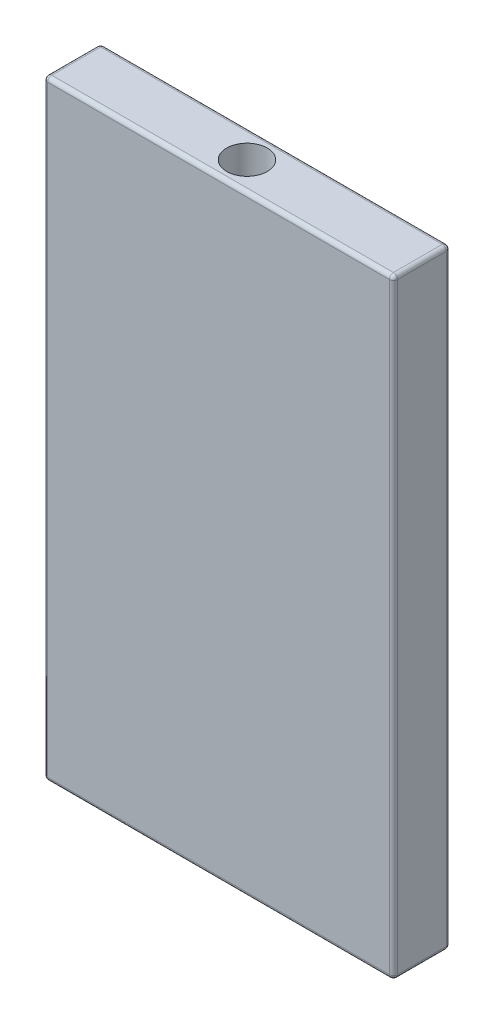
ISO-10303-21;
HEADER;
FILE_DESCRIPTION(('STEP AP214'),'2;1');
FILE_NAME('part.step','',(''),(''),'','','');
FILE_SCHEMA(('AUTOMOTIVE_DESIGN { 1 0 10303 214 1 1 1 1 }'));
ENDSEC;
DATA;
#1=APPLICATION_CONTEXT('core data for automotive mechanical design processes');
#2=APPLICATION_PROTOCOL_DEFINITION('international standard','automotive_design',2000,#1);
#3=PRODUCT_CONTEXT('',#1,'mechanical');
#4=PRODUCT('Part','Part','',(#3));
#5=PRODUCT_RELATED_PRODUCT_CATEGORY('part','',(#4));
#6=PRODUCT_DEFINITION_FORMATION('','',#4);
#7=PRODUCT_DEFINITION_CONTEXT('part definition',#1,'design');
#8=PRODUCT_DEFINITION('design','',#6,#7);
#9=PRODUCT_DEFINITION_SHAPE('','',#8);
#10=(LENGTH_UNIT() NAMED_UNIT(*) SI_UNIT(.MILLI.,.METRE.));
#11=(NAMED_UNIT(*) PLANE_ANGLE_UNIT() SI_UNIT($,.RADIAN.));
#12=(NAMED_UNIT(*) SI_UNIT($,.STERADIAN.) SOLID_ANGLE_UNIT());
#13=UNCERTAINTY_MEASURE_WITH_UNIT(LENGTH_MEASURE(1.E-05),#10,'distance_accuracy_value','');
#14=(GEOMETRIC_REPRESENTATION_CONTEXT(3) GLOBAL_UNCERTAINTY_ASSIGNED_CONTEXT((#13)) GLOBAL_UNIT_ASSIGNED_CONTEXT((#10,
#11,#12)) REPRESENTATION_CONTEXT('',''));
#15=CARTESIAN_POINT('',(0.,0.,0.));
#16=DIRECTION('',(0.,0.,1.));
#17=DIRECTION('',(1.,0.,0.));
#18=AXIS2_PLACEMENT_3D('',#15,#16,#17);
#19=CARTESIAN_POINT('',(21.5,37.5,7.));
#20=DIRECTION('',(-1.,0.,0.));
#21=DIRECTION('',(0.,-1.,0.));
#22=AXIS2_PLACEMENT_3D('',#19,#20,#21);
#23=PLANE('',#22);
#24=DIRECTION('',(0.,1.,0.));
#25=VECTOR('',#24,1.);
#26=CARTESIAN_POINT('',(21.5,-37.5,6.5));
#27=LINE('',#26,#25);
#28=CARTESIAN_POINT('',(21.5,37.,6.5));
#29=VERTEX_POINT('',#28);
#30=CARTESIAN_POINT('',(21.5,-37.,6.5));
#31=VERTEX_POINT('',#30);
#32=EDGE_CURVE('E148',#29,#31,#27,.F.);
#33=ORIENTED_EDGE('',*,*,#32,.T.);
#34=DIRECTION('',(0.,0.,-1.));
#35=VECTOR('',#34,1.);
#36=CARTESIAN_POINT('',(21.5,-37.,7.));
#37=LINE('',#36,#35);
#38=CARTESIAN_POINT('',(21.5,-37.,0.5));
#39=VERTEX_POINT('',#38);
#40=EDGE_CURVE('E229',#31,#39,#37,.T.);
#41=ORIENTED_EDGE('',*,*,#40,.T.);
#42=DIRECTION('',(0.,1.,0.));
#43=VECTOR('',#42,1.);
#44=CARTESIAN_POINT('',(21.5,37.5,0.5));
#45=LINE('',#44,#43);
#46=CARTESIAN_POINT('',(21.5,37.,0.5));
#47=VERTEX_POINT('',#46);
#48=EDGE_CURVE('E167',#39,#47,#45,.T.);
#49=ORIENTED_EDGE('',*,*,#48,.T.);
#50=DIRECTION('',(0.,0.,-1.));
#51=VECTOR('',#50,1.);
#52=CARTESIAN_POINT('',(21.5,37.,7.));
#53=LINE('',#52,#51);
#54=EDGE_CURVE('E227',#47,#29,#53,.F.);
#55=ORIENTED_EDGE('',*,*,#54,.T.);
#56=EDGE_LOOP('',(#33,#41,#49,#55));
#57=FACE_BOUND('',#56,.T.);
#58=ADVANCED_FACE('F36',(#57),#23,.F.);
#59=CARTESIAN_POINT('',(-21.5,37.5,7.));
#60=DIRECTION('',(0.,-1.,0.));
#61=DIRECTION('',(0.,0.,-1.));
#62=AXIS2_PLACEMENT_3D('',#59,#60,#61);
#63=PLANE('',#62);
#64=CARTESIAN_POINT('',(0.,37.5,3.5));
#65=DIRECTION('',(0.,1.,0.));
#66=DIRECTION('',(0.,0.,1.));
#67=AXIS2_PLACEMENT_3D('',#64,#65,#66);
#68=CIRCLE('',#67,2.5);
#69=CARTESIAN_POINT('',(0.,37.5,6.));
#70=VERTEX_POINT('',#69);
#71=EDGE_CURVE('E246',#70,#70,#68,.T.);
#72=ORIENTED_EDGE('',*,*,#71,.F.);
#73=EDGE_LOOP('',(#72));
#74=FACE_BOUND('',#73,.T.);
#75=DIRECTION('',(-1.,0.,0.));
#76=VECTOR('',#75,1.);
#77=CARTESIAN_POINT('',(-21.5,37.5,0.5));
#78=LINE('',#77,#76);
#79=CARTESIAN_POINT('',(21.,37.5,0.5));
#80=VERTEX_POINT('',#79);
#81=CARTESIAN_POINT('',(-21.,37.5,0.5));
#82=VERTEX_POINT('',#81);
#83=EDGE_CURVE('E187',#80,#82,#78,.T.);
#84=ORIENTED_EDGE('',*,*,#83,.T.);
#85=DIRECTION('',(0.,0.,-1.));
#86=VECTOR('',#85,1.);
#87=CARTESIAN_POINT('',(-21.,37.5,7.));
#88=LINE('',#87,#86);
#89=CARTESIAN_POINT('',(-21.,37.5,6.5));
#90=VERTEX_POINT('',#89);
#91=EDGE_CURVE('E11',#82,#90,#88,.F.);
#92=ORIENTED_EDGE('',*,*,#91,.T.);
#93=DIRECTION('',(-1.,0.,0.));
#94=VECTOR('',#93,1.);
#95=CARTESIAN_POINT('',(21.5,37.5,6.5));
#96=LINE('',#95,#94);
#97=CARTESIAN_POINT('',(21.,37.5,6.5));
#98=VERTEX_POINT('',#97);
#99=EDGE_CURVE('E189',#90,#98,#96,.F.);
#100=ORIENTED_EDGE('',*,*,#99,.T.);
#101=DIRECTION('',(0.,0.,-1.));
#102=VECTOR('',#101,1.);
#103=CARTESIAN_POINT('',(21.,37.5,7.));
#104=LINE('',#103,#102);
#105=EDGE_CURVE('E45',#98,#80,#104,.T.);
#106=ORIENTED_EDGE('',*,*,#105,.T.);
#107=EDGE_LOOP('',(#84,#92,#100,#106));
#108=FACE_BOUND('',#107,.T.);
#109=ADVANCED_FACE('F329',(#74,#108),#63,.F.);
#110=CARTESIAN_POINT('',(-21.5,37.5,7.));
#111=DIRECTION('',(1.,0.,0.));
#112=DIRECTION('',(0.,1.,0.));
#113=AXIS2_PLACEMENT_3D('',#110,#111,#112);
#114=PLANE('',#113);
#115=DIRECTION('',(0.,-1.,0.));
#116=VECTOR('',#115,1.);
#117=CARTESIAN_POINT('',(-21.5,37.5,0.5));
#118=LINE('',#117,#116);
#119=CARTESIAN_POINT('',(-21.5,37.,0.5));
#120=VERTEX_POINT('',#119);
#121=CARTESIAN_POINT('',(-21.5,-37.,0.5));
#122=VERTEX_POINT('',#121);
#123=EDGE_CURVE('E181',#120,#122,#118,.T.);
#124=ORIENTED_EDGE('',*,*,#123,.T.);
#125=DIRECTION('',(0.,0.,-1.));
#126=VECTOR('',#125,1.);
#127=CARTESIAN_POINT('',(-21.5,-37.,7.));
#128=LINE('',#127,#126);
#129=CARTESIAN_POINT('',(-21.5,-37.,6.5));
#130=VERTEX_POINT('',#129);
#131=EDGE_CURVE('E237',#122,#130,#128,.F.);
#132=ORIENTED_EDGE('',*,*,#131,.T.);
#133=DIRECTION('',(0.,-1.,0.));
#134=VECTOR('',#133,1.);
#135=CARTESIAN_POINT('',(-21.5,37.5,6.5));
#136=LINE('',#135,#134);
#137=CARTESIAN_POINT('',(-21.5,37.,6.5));
#138=VERTEX_POINT('',#137);
#139=EDGE_CURVE('E184',#130,#138,#136,.F.);
#140=ORIENTED_EDGE('',*,*,#139,.T.);
#141=DIRECTION('',(0.,0.,-1.));
#142=VECTOR('',#141,1.);
#143=CARTESIAN_POINT('',(-21.5,37.,7.));
#144=LINE('',#143,#142);
#145=EDGE_CURVE('E235',#138,#120,#144,.T.);
#146=ORIENTED_EDGE('',*,*,#145,.T.);
#147=EDGE_LOOP('',(#124,#132,#140,#146));
#148=FACE_BOUND('',#147,.T.);
#149=ADVANCED_FACE('F290',(#148),#114,.F.);
#150=CARTESIAN_POINT('',(-21.5,-37.5,7.));
#151=DIRECTION('',(0.,1.,0.));
#152=DIRECTION('',(0.,0.,1.));
#153=AXIS2_PLACEMENT_3D('',#150,#151,#152);
#154=PLANE('',#153);
#155=CARTESIAN_POINT('',(0.,-37.5,3.5));
#156=DIRECTION('',(0.,1.,0.));
#157=DIRECTION('',(0.,0.,1.));
#158=AXIS2_PLACEMENT_3D('',#155,#156,#157);
#159=CIRCLE('',#158,2.5);
#160=CARTESIAN_POINT('',(0.,-37.5,6.));
#161=VERTEX_POINT('',#160);
#162=EDGE_CURVE('E161',#161,#161,#159,.F.);
#163=ORIENTED_EDGE('',*,*,#162,.F.);
#164=EDGE_LOOP('',(#163));
#165=FACE_BOUND('',#164,.T.);
#166=DIRECTION('',(1.,0.,0.));
#167=VECTOR('',#166,1.);
#168=CARTESIAN_POINT('',(-21.5,-37.5,0.5));
#169=LINE('',#168,#167);
#170=CARTESIAN_POINT('',(-21.,-37.5,0.5));
#171=VERTEX_POINT('',#170);
#172=CARTESIAN_POINT('',(21.,-37.5,0.5));
#173=VERTEX_POINT('',#172);
#174=EDGE_CURVE('E175',#171,#173,#169,.T.);
#175=ORIENTED_EDGE('',*,*,#174,.T.);
#176=DIRECTION('',(0.,0.,-1.));
#177=VECTOR('',#176,1.);
#178=CARTESIAN_POINT('',(21.,-37.5,7.));
#179=LINE('',#178,#177);
#180=CARTESIAN_POINT('',(21.,-37.5,6.5));
#181=VERTEX_POINT('',#180);
#182=EDGE_CURVE('E233',#173,#181,#179,.F.);
#183=ORIENTED_EDGE('',*,*,#182,.T.);
#184=DIRECTION('',(1.,0.,0.));
#185=VECTOR('',#184,1.);
#186=CARTESIAN_POINT('',(-21.5,-37.5,6.5));
#187=LINE('',#186,#185);
#188=CARTESIAN_POINT('',(-21.,-37.5,6.5));
#189=VERTEX_POINT('',#188);
#190=EDGE_CURVE('E178',#181,#189,#187,.F.);
#191=ORIENTED_EDGE('',*,*,#190,.T.);
#192=DIRECTION('',(0.,0.,-1.));
#193=VECTOR('',#192,1.);
#194=CARTESIAN_POINT('',(-21.,-37.5,7.));
#195=LINE('',#194,#193);
#196=EDGE_CURVE('E231',#189,#171,#195,.T.);
#197=ORIENTED_EDGE('',*,*,#196,.T.);
#198=EDGE_LOOP('',(#175,#183,#191,#197));
#199=FACE_BOUND('',#198,.T.);
#200=ADVANCED_FACE('F303',(#165,#199),#154,.F.);
#201=CARTESIAN_POINT('',(0.,0.,7.));
#202=DIRECTION('',(0.,0.,1.));
#203=DIRECTION('',(1.,0.,0.));
#204=AXIS2_PLACEMENT_3D('',#201,#202,#203);
#205=PLANE('',#204);
#206=DIRECTION('',(1.,0.,0.));
#207=VECTOR('',#206,1.);
#208=CARTESIAN_POINT('',(21.5,-37.,7.));
#209=LINE('',#208,#207);
#210=CARTESIAN_POINT('',(-21.,-37.,7.));
#211=VERTEX_POINT('',#210);
#212=CARTESIAN_POINT('',(21.,-37.,7.));
#213=VERTEX_POINT('',#212);
#214=EDGE_CURVE('E166',#211,#213,#209,.T.);
#215=ORIENTED_EDGE('',*,*,#214,.T.);
#216=DIRECTION('',(0.,1.,0.));
#217=VECTOR('',#216,1.);
#218=CARTESIAN_POINT('',(21.,37.5,7.));
#219=LINE('',#218,#217);
#220=CARTESIAN_POINT('',(21.,37.,7.));
#221=VERTEX_POINT('',#220);
#222=EDGE_CURVE('E145',#213,#221,#219,.T.);
#223=ORIENTED_EDGE('',*,*,#222,.T.);
#224=DIRECTION('',(-1.,0.,0.));
#225=VECTOR('',#224,1.);
#226=CARTESIAN_POINT('',(-21.5,37.,7.));
#227=LINE('',#226,#225);
#228=CARTESIAN_POINT('',(-21.,37.,7.));
#229=VERTEX_POINT('',#228);
#230=EDGE_CURVE('E154',#221,#229,#227,.T.);
#231=ORIENTED_EDGE('',*,*,#230,.T.);
#232=DIRECTION('',(0.,-1.,0.));
#233=VECTOR('',#232,1.);
#234=CARTESIAN_POINT('',(-21.,-37.5,7.));
#235=LINE('',#234,#233);
#236=EDGE_CURVE('E160',#229,#211,#235,.T.);
#237=ORIENTED_EDGE('',*,*,#236,.T.);
#238=EDGE_LOOP('',(#215,#223,#231,#237));
#239=FACE_BOUND('',#238,.T.);
#240=ADVANCED_FACE('F164',(#239),#205,.T.);
#241=CARTESIAN_POINT('',(0.,0.,0.));
#242=DIRECTION('',(0.,0.,1.));
#243=DIRECTION('',(1.,0.,0.));
#244=AXIS2_PLACEMENT_3D('',#241,#242,#243);
#245=PLANE('',#244);
#246=DIRECTION('',(0.,-1.,0.));
#247=VECTOR('',#246,1.);
#248=CARTESIAN_POINT('',(-21.,0.,0.));
#249=LINE('',#248,#247);
#250=CARTESIAN_POINT('',(-21.,-37.,0.));
#251=VERTEX_POINT('',#250);
#252=CARTESIAN_POINT('',(-21.,37.,0.));
#253=VERTEX_POINT('',#252);
#254=EDGE_CURVE('E191',#251,#253,#249,.F.);
#255=ORIENTED_EDGE('',*,*,#254,.T.);
#256=DIRECTION('',(-1.,0.,0.));
#257=VECTOR('',#256,1.);
#258=CARTESIAN_POINT('',(0.,37.,0.));
#259=LINE('',#258,#257);
#260=CARTESIAN_POINT('',(21.,37.,0.));
#261=VERTEX_POINT('',#260);
#262=EDGE_CURVE('E150',#253,#261,#259,.F.);
#263=ORIENTED_EDGE('',*,*,#262,.T.);
#264=DIRECTION('',(0.,1.,0.));
#265=VECTOR('',#264,1.);
#266=CARTESIAN_POINT('',(21.,0.,0.));
#267=LINE('',#266,#265);
#268=CARTESIAN_POINT('',(21.,-37.,0.));
#269=VERTEX_POINT('',#268);
#270=EDGE_CURVE('E197',#261,#269,#267,.F.);
#271=ORIENTED_EDGE('',*,*,#270,.T.);
#272=DIRECTION('',(1.,0.,0.));
#273=VECTOR('',#272,1.);
#274=CARTESIAN_POINT('',(0.,-37.,0.));
#275=LINE('',#274,#273);
#276=EDGE_CURVE('E194',#269,#251,#275,.F.);
#277=ORIENTED_EDGE('',*,*,#276,.T.);
#278=EDGE_LOOP('',(#255,#263,#271,#277));
#279=FACE_BOUND('',#278,.T.);
#280=ADVANCED_FACE('F272',(#279),#245,.F.);
#281=CARTESIAN_POINT('',(0.,-37.501,3.5));
#282=DIRECTION('',(0.,1.,0.));
#283=DIRECTION('',(0.,0.,1.));
#284=AXIS2_PLACEMENT_3D('',#281,#282,#283);
#285=CYLINDRICAL_SURFACE('',#284,2.5);
#286=ORIENTED_EDGE('',*,*,#71,.T.);
#287=EDGE_LOOP('',(#286));
#288=FACE_BOUND('',#287,.T.);
#289=ORIENTED_EDGE('',*,*,#162,.T.);
#290=EDGE_LOOP('',(#289));
#291=FACE_BOUND('',#290,.T.);
#292=ADVANCED_FACE('F344',(#288,#291),#285,.F.);
#293=CARTESIAN_POINT('',(-21.,0.,6.5));
#294=DIRECTION('',(0.,1.,0.));
#295=DIRECTION('',(-1.,0.,0.));
#296=AXIS2_PLACEMENT_3D('',#293,#294,#295);
#297=CYLINDRICAL_SURFACE('',#296,0.5);
#298=ORIENTED_EDGE('',*,*,#139,.F.);
#299=CARTESIAN_POINT('',(-21.,-37.,6.5));
#300=DIRECTION('',(0.,1.,0.));
#301=DIRECTION('',(-1.,0.,0.));
#302=AXIS2_PLACEMENT_3D('',#299,#300,#301);
#303=CIRCLE('',#302,0.5);
#304=EDGE_CURVE('E218',#130,#211,#303,.T.);
#305=ORIENTED_EDGE('',*,*,#304,.T.);
#306=ORIENTED_EDGE('',*,*,#236,.F.);
#307=CARTESIAN_POINT('',(-21.,37.,6.5));
#308=DIRECTION('',(0.,1.,0.));
#309=DIRECTION('',(-1.,0.,0.));
#310=AXIS2_PLACEMENT_3D('',#307,#308,#309);
#311=CIRCLE('',#310,0.5);
#312=EDGE_CURVE('E216',#229,#138,#311,.F.);
#313=ORIENTED_EDGE('',*,*,#312,.T.);
#314=EDGE_LOOP('',(#298,#305,#306,#313));
#315=FACE_BOUND('',#314,.T.);
#316=ADVANCED_FACE('F294',(#315),#297,.T.);
#317=CARTESIAN_POINT('',(0.,-37.,6.5));
#318=DIRECTION('',(-1.,0.,0.));
#319=DIRECTION('',(0.,0.,1.));
#320=AXIS2_PLACEMENT_3D('',#317,#318,#319);
#321=CYLINDRICAL_SURFACE('',#320,0.5);
#322=ORIENTED_EDGE('',*,*,#190,.F.);
#323=CARTESIAN_POINT('',(21.,-37.,6.5));
#324=DIRECTION('',(-1.,0.,0.));
#325=DIRECTION('',(0.,0.,1.));
#326=AXIS2_PLACEMENT_3D('',#323,#324,#325);
#327=CIRCLE('',#326,0.5);
#328=EDGE_CURVE('E206',#181,#213,#327,.T.);
#329=ORIENTED_EDGE('',*,*,#328,.T.);
#330=ORIENTED_EDGE('',*,*,#214,.F.);
#331=CARTESIAN_POINT('',(-21.,-37.,6.5));
#332=DIRECTION('',(-1.,0.,0.));
#333=DIRECTION('',(0.,0.,1.));
#334=AXIS2_PLACEMENT_3D('',#331,#332,#333);
#335=CIRCLE('',#334,0.5);
#336=EDGE_CURVE('E203',#211,#189,#335,.F.);
#337=ORIENTED_EDGE('',*,*,#336,.T.);
#338=EDGE_LOOP('',(#322,#329,#330,#337));
#339=FACE_BOUND('',#338,.T.);
#340=ADVANCED_FACE('F300',(#339),#321,.T.);
#341=CARTESIAN_POINT('',(0.,37.,6.5));
#342=DIRECTION('',(1.,0.,0.));
#343=DIRECTION('',(0.,0.,-1.));
#344=AXIS2_PLACEMENT_3D('',#341,#342,#343);
#345=CYLINDRICAL_SURFACE('',#344,0.5);
#346=ORIENTED_EDGE('',*,*,#99,.F.);
#347=CARTESIAN_POINT('',(-21.,37.,6.5));
#348=DIRECTION('',(1.,0.,0.));
#349=DIRECTION('',(0.,0.,-1.));
#350=AXIS2_PLACEMENT_3D('',#347,#348,#349);
#351=CIRCLE('',#350,0.5);
#352=EDGE_CURVE('E136',#90,#229,#351,.T.);
#353=ORIENTED_EDGE('',*,*,#352,.T.);
#354=ORIENTED_EDGE('',*,*,#230,.F.);
#355=CARTESIAN_POINT('',(21.,37.,6.5));
#356=DIRECTION('',(1.,0.,0.));
#357=DIRECTION('',(0.,0.,-1.));
#358=AXIS2_PLACEMENT_3D('',#355,#356,#357);
#359=CIRCLE('',#358,0.5);
#360=EDGE_CURVE('E127',#221,#98,#359,.F.);
#361=ORIENTED_EDGE('',*,*,#360,.T.);
#362=EDGE_LOOP('',(#346,#353,#354,#361));
#363=FACE_BOUND('',#362,.T.);
#364=ADVANCED_FACE('F155',(#363),#345,.T.);
#365=CARTESIAN_POINT('',(21.,0.,6.5));
#366=DIRECTION('',(0.,-1.,0.));
#367=DIRECTION('',(1.,0.,0.));
#368=AXIS2_PLACEMENT_3D('',#365,#366,#367);
#369=CYLINDRICAL_SURFACE('',#368,0.5);
#370=ORIENTED_EDGE('',*,*,#222,.F.);
#371=CARTESIAN_POINT('',(21.,-37.,6.5));
#372=DIRECTION('',(0.,-1.,0.));
#373=DIRECTION('',(1.,0.,0.));
#374=AXIS2_PLACEMENT_3D('',#371,#372,#373);
#375=CIRCLE('',#374,0.5);
#376=EDGE_CURVE('E149',#213,#31,#375,.F.);
#377=ORIENTED_EDGE('',*,*,#376,.T.);
#378=ORIENTED_EDGE('',*,*,#32,.F.);
#379=CARTESIAN_POINT('',(21.,37.,6.5));
#380=DIRECTION('',(0.,-1.,0.));
#381=DIRECTION('',(1.,0.,0.));
#382=AXIS2_PLACEMENT_3D('',#379,#380,#381);
#383=CIRCLE('',#382,0.5);
#384=EDGE_CURVE('E130',#29,#221,#383,.T.);
#385=ORIENTED_EDGE('',*,*,#384,.T.);
#386=EDGE_LOOP('',(#370,#377,#378,#385));
#387=FACE_BOUND('',#386,.T.);
#388=ADVANCED_FACE('F142',(#387),#369,.T.);
#389=CARTESIAN_POINT('',(-21.5,-37.,0.5));
#390=DIRECTION('',(1.,0.,0.));
#391=DIRECTION('',(0.,0.,-1.));
#392=AXIS2_PLACEMENT_3D('',#389,#390,#391);
#393=CYLINDRICAL_SURFACE('',#392,0.5);
#394=ORIENTED_EDGE('',*,*,#276,.F.);
#395=CARTESIAN_POINT('',(21.,-37.,0.5));
#396=DIRECTION('',(1.,0.,0.));
#397=DIRECTION('',(0.,0.,-1.));
#398=AXIS2_PLACEMENT_3D('',#395,#396,#397);
#399=CIRCLE('',#398,0.5);
#400=EDGE_CURVE('E214',#269,#173,#399,.F.);
#401=ORIENTED_EDGE('',*,*,#400,.T.);
#402=ORIENTED_EDGE('',*,*,#174,.F.);
#403=CARTESIAN_POINT('',(-21.,-37.,0.5));
#404=DIRECTION('',(1.,0.,0.));
#405=DIRECTION('',(0.,0.,-1.));
#406=AXIS2_PLACEMENT_3D('',#403,#404,#405);
#407=CIRCLE('',#406,0.5);
#408=EDGE_CURVE('E212',#171,#251,#407,.T.);
#409=ORIENTED_EDGE('',*,*,#408,.T.);
#410=EDGE_LOOP('',(#394,#401,#402,#409));
#411=FACE_BOUND('',#410,.T.);
#412=ADVANCED_FACE('F318',(#411),#393,.T.);
#413=CARTESIAN_POINT('',(21.,37.5,0.5));
#414=DIRECTION('',(0.,1.,0.));
#415=DIRECTION('',(-1.,0.,0.));
#416=AXIS2_PLACEMENT_3D('',#413,#414,#415);
#417=CYLINDRICAL_SURFACE('',#416,0.5);
#418=ORIENTED_EDGE('',*,*,#48,.F.);
#419=CARTESIAN_POINT('',(21.,-37.,0.5));
#420=DIRECTION('',(0.,1.,0.));
#421=DIRECTION('',(-1.,0.,0.));
#422=AXIS2_PLACEMENT_3D('',#419,#420,#421);
#423=CIRCLE('',#422,0.5);
#424=EDGE_CURVE('E210',#39,#269,#423,.T.);
#425=ORIENTED_EDGE('',*,*,#424,.T.);
#426=ORIENTED_EDGE('',*,*,#270,.F.);
#427=CARTESIAN_POINT('',(21.,37.,0.5));
#428=DIRECTION('',(0.,1.,0.));
#429=DIRECTION('',(-1.,0.,0.));
#430=AXIS2_PLACEMENT_3D('',#427,#428,#429);
#431=CIRCLE('',#430,0.5);
#432=EDGE_CURVE('E208',#261,#47,#431,.F.);
#433=ORIENTED_EDGE('',*,*,#432,.T.);
#434=EDGE_LOOP('',(#418,#425,#426,#433));
#435=FACE_BOUND('',#434,.T.);
#436=ADVANCED_FACE('F268',(#435),#417,.T.);
#437=CARTESIAN_POINT('',(-21.,37.5,0.5));
#438=DIRECTION('',(0.,-1.,0.));
#439=DIRECTION('',(1.,0.,0.));
#440=AXIS2_PLACEMENT_3D('',#437,#438,#439);
#441=CYLINDRICAL_SURFACE('',#440,0.5);
#442=ORIENTED_EDGE('',*,*,#254,.F.);
#443=CARTESIAN_POINT('',(-21.,-37.,0.5));
#444=DIRECTION('',(0.,-1.,0.));
#445=DIRECTION('',(1.,0.,0.));
#446=AXIS2_PLACEMENT_3D('',#443,#444,#445);
#447=CIRCLE('',#446,0.5);
#448=EDGE_CURVE('E137',#251,#122,#447,.F.);
#449=ORIENTED_EDGE('',*,*,#448,.T.);
#450=ORIENTED_EDGE('',*,*,#123,.F.);
#451=CARTESIAN_POINT('',(-21.,37.,0.5));
#452=DIRECTION('',(0.,-1.,0.));
#453=DIRECTION('',(1.,0.,0.));
#454=AXIS2_PLACEMENT_3D('',#451,#452,#453);
#455=CIRCLE('',#454,0.5);
#456=EDGE_CURVE('E220',#120,#253,#455,.T.);
#457=ORIENTED_EDGE('',*,*,#456,.T.);
#458=EDGE_LOOP('',(#442,#449,#450,#457));
#459=FACE_BOUND('',#458,.T.);
#460=ADVANCED_FACE('F276',(#459),#441,.T.);
#461=CARTESIAN_POINT('',(-21.5,37.,0.5));
#462=DIRECTION('',(-1.,0.,0.));
#463=DIRECTION('',(0.,0.,1.));
#464=AXIS2_PLACEMENT_3D('',#461,#462,#463);
#465=CYLINDRICAL_SURFACE('',#464,0.5);
#466=ORIENTED_EDGE('',*,*,#262,.F.);
#467=CARTESIAN_POINT('',(-21.,37.,0.5));
#468=DIRECTION('',(-1.,0.,0.));
#469=DIRECTION('',(0.,0.,1.));
#470=AXIS2_PLACEMENT_3D('',#467,#468,#469);
#471=CIRCLE('',#470,0.5);
#472=EDGE_CURVE('E53',#253,#82,#471,.F.);
#473=ORIENTED_EDGE('',*,*,#472,.T.);
#474=ORIENTED_EDGE('',*,*,#83,.F.);
#475=CARTESIAN_POINT('',(21.,37.,0.5));
#476=DIRECTION('',(-1.,0.,0.));
#477=DIRECTION('',(0.,0.,1.));
#478=AXIS2_PLACEMENT_3D('',#475,#476,#477);
#479=CIRCLE('',#478,0.5);
#480=EDGE_CURVE('E224',#80,#261,#479,.T.);
#481=ORIENTED_EDGE('',*,*,#480,.T.);
#482=EDGE_LOOP('',(#466,#473,#474,#481));
#483=FACE_BOUND('',#482,.T.);
#484=ADVANCED_FACE('F265',(#483),#465,.T.);
#485=CARTESIAN_POINT('',(21.,-37.,0.5));
#486=DIRECTION('',(0.,0.,1.));
#487=DIRECTION('',(1.,0.,0.));
#488=AXIS2_PLACEMENT_3D('',#485,#486,#487);
#489=SPHERICAL_SURFACE('',#488,0.5);
#490=ORIENTED_EDGE('',*,*,#400,.F.);
#491=ORIENTED_EDGE('',*,*,#424,.F.);
#492=CARTESIAN_POINT('',(21.,-37.,0.5));
#493=DIRECTION('',(0.,0.,1.));
#494=DIRECTION('',(1.,0.,0.));
#495=AXIS2_PLACEMENT_3D('',#492,#493,#494);
#496=CIRCLE('',#495,0.5);
#497=EDGE_CURVE('E242',#173,#39,#496,.T.);
#498=ORIENTED_EDGE('',*,*,#497,.F.);
#499=EDGE_LOOP('',(#490,#491,#498));
#500=FACE_BOUND('',#499,.T.);
#501=ADVANCED_FACE('F316',(#500),#489,.T.);
#502=CARTESIAN_POINT('',(21.,-37.,7.));
#503=DIRECTION('',(0.,0.,-1.));
#504=DIRECTION('',(-1.,0.,0.));
#505=AXIS2_PLACEMENT_3D('',#502,#503,#504);
#506=CYLINDRICAL_SURFACE('',#505,0.5);
#507=ORIENTED_EDGE('',*,*,#497,.T.);
#508=ORIENTED_EDGE('',*,*,#40,.F.);
#509=CARTESIAN_POINT('',(21.,-37.,6.5));
#510=DIRECTION('',(0.,0.,1.));
#511=DIRECTION('',(1.,0.,0.));
#512=AXIS2_PLACEMENT_3D('',#509,#510,#511);
#513=CIRCLE('',#512,0.5);
#514=EDGE_CURVE('E240',#181,#31,#513,.T.);
#515=ORIENTED_EDGE('',*,*,#514,.F.);
#516=ORIENTED_EDGE('',*,*,#182,.F.);
#517=EDGE_LOOP('',(#507,#508,#515,#516));
#518=FACE_BOUND('',#517,.T.);
#519=ADVANCED_FACE('F309',(#518),#506,.T.);
#520=CARTESIAN_POINT('',(21.,-37.,6.5));
#521=DIRECTION('',(0.,0.,1.));
#522=DIRECTION('',(1.,0.,0.));
#523=AXIS2_PLACEMENT_3D('',#520,#521,#522);
#524=SPHERICAL_SURFACE('',#523,0.5);
#525=ORIENTED_EDGE('',*,*,#376,.F.);
#526=ORIENTED_EDGE('',*,*,#328,.F.);
#527=ORIENTED_EDGE('',*,*,#514,.T.);
#528=EDGE_LOOP('',(#525,#526,#527));
#529=FACE_BOUND('',#528,.T.);
#530=ADVANCED_FACE('F312',(#529),#524,.T.);
#531=CARTESIAN_POINT('',(-21.,-37.,0.5));
#532=DIRECTION('',(0.,0.,1.));
#533=DIRECTION('',(1.,0.,0.));
#534=AXIS2_PLACEMENT_3D('',#531,#532,#533);
#535=SPHERICAL_SURFACE('',#534,0.5);
#536=ORIENTED_EDGE('',*,*,#448,.F.);
#537=ORIENTED_EDGE('',*,*,#408,.F.);
#538=CARTESIAN_POINT('',(-21.,-37.,0.5));
#539=DIRECTION('',(0.,0.,1.));
#540=DIRECTION('',(1.,0.,0.));
#541=AXIS2_PLACEMENT_3D('',#538,#539,#540);
#542=CIRCLE('',#541,0.5);
#543=EDGE_CURVE('E243',#122,#171,#542,.T.);
#544=ORIENTED_EDGE('',*,*,#543,.F.);
#545=EDGE_LOOP('',(#536,#537,#544));
#546=FACE_BOUND('',#545,.T.);
#547=ADVANCED_FACE('F282',(#546),#535,.T.);
#548=CARTESIAN_POINT('',(-21.,-37.,7.));
#549=DIRECTION('',(0.,0.,-1.));
#550=DIRECTION('',(-1.,0.,0.));
#551=AXIS2_PLACEMENT_3D('',#548,#549,#550);
#552=CYLINDRICAL_SURFACE('',#551,0.5);
#553=ORIENTED_EDGE('',*,*,#543,.T.);
#554=ORIENTED_EDGE('',*,*,#196,.F.);
#555=CARTESIAN_POINT('',(-21.,-37.,6.5));
#556=DIRECTION('',(0.,0.,1.));
#557=DIRECTION('',(1.,0.,0.));
#558=AXIS2_PLACEMENT_3D('',#555,#556,#557);
#559=CIRCLE('',#558,0.5);
#560=EDGE_CURVE('E247',#130,#189,#559,.T.);
#561=ORIENTED_EDGE('',*,*,#560,.F.);
#562=ORIENTED_EDGE('',*,*,#131,.F.);
#563=EDGE_LOOP('',(#553,#554,#561,#562));
#564=FACE_BOUND('',#563,.T.);
#565=ADVANCED_FACE('F287',(#564),#552,.T.);
#566=CARTESIAN_POINT('',(-21.,-37.,6.5));
#567=DIRECTION('',(0.,0.,1.));
#568=DIRECTION('',(1.,0.,0.));
#569=AXIS2_PLACEMENT_3D('',#566,#567,#568);
#570=SPHERICAL_SURFACE('',#569,0.5);
#571=ORIENTED_EDGE('',*,*,#336,.F.);
#572=ORIENTED_EDGE('',*,*,#304,.F.);
#573=ORIENTED_EDGE('',*,*,#560,.T.);
#574=EDGE_LOOP('',(#571,#572,#573));
#575=FACE_BOUND('',#574,.T.);
#576=ADVANCED_FACE('F297',(#575),#570,.T.);
#577=CARTESIAN_POINT('',(-21.,37.,0.5));
#578=DIRECTION('',(0.,0.,1.));
#579=DIRECTION('',(1.,0.,0.));
#580=AXIS2_PLACEMENT_3D('',#577,#578,#579);
#581=SPHERICAL_SURFACE('',#580,0.5);
#582=ORIENTED_EDGE('',*,*,#472,.F.);
#583=ORIENTED_EDGE('',*,*,#456,.F.);
#584=CARTESIAN_POINT('',(-21.,37.,0.5));
#585=DIRECTION('',(0.,0.,1.));
#586=DIRECTION('',(1.,0.,0.));
#587=AXIS2_PLACEMENT_3D('',#584,#585,#586);
#588=CIRCLE('',#587,0.5);
#589=EDGE_CURVE('E249',#82,#120,#588,.T.);
#590=ORIENTED_EDGE('',*,*,#589,.F.);
#591=EDGE_LOOP('',(#582,#583,#590));
#592=FACE_BOUND('',#591,.T.);
#593=ADVANCED_FACE('F391',(#592),#581,.T.);
#594=CARTESIAN_POINT('',(-21.,37.,7.));
#595=DIRECTION('',(0.,0.,-1.));
#596=DIRECTION('',(-1.,0.,0.));
#597=AXIS2_PLACEMENT_3D('',#594,#595,#596);
#598=CYLINDRICAL_SURFACE('',#597,0.5);
#599=ORIENTED_EDGE('',*,*,#589,.T.);
#600=ORIENTED_EDGE('',*,*,#145,.F.);
#601=CARTESIAN_POINT('',(-21.,37.,6.5));
#602=DIRECTION('',(0.,0.,1.));
#603=DIRECTION('',(1.,0.,0.));
#604=AXIS2_PLACEMENT_3D('',#601,#602,#603);
#605=CIRCLE('',#604,0.5);
#606=EDGE_CURVE('E252',#90,#138,#605,.T.);
#607=ORIENTED_EDGE('',*,*,#606,.F.);
#608=ORIENTED_EDGE('',*,*,#91,.F.);
#609=EDGE_LOOP('',(#599,#600,#607,#608));
#610=FACE_BOUND('',#609,.T.);
#611=ADVANCED_FACE('F398',(#610),#598,.T.);
#612=CARTESIAN_POINT('',(-21.,37.,6.5));
#613=DIRECTION('',(0.,0.,1.));
#614=DIRECTION('',(1.,0.,0.));
#615=AXIS2_PLACEMENT_3D('',#612,#613,#614);
#616=SPHERICAL_SURFACE('',#615,0.5);
#617=ORIENTED_EDGE('',*,*,#606,.T.);
#618=ORIENTED_EDGE('',*,*,#312,.F.);
#619=ORIENTED_EDGE('',*,*,#352,.F.);
#620=EDGE_LOOP('',(#617,#618,#619));
#621=FACE_BOUND('',#620,.T.);
#622=ADVANCED_FACE('F406',(#621),#616,.T.);
#623=CARTESIAN_POINT('',(21.,37.,0.5));
#624=DIRECTION('',(0.,0.,1.));
#625=DIRECTION('',(1.,0.,0.));
#626=AXIS2_PLACEMENT_3D('',#623,#624,#625);
#627=SPHERICAL_SURFACE('',#626,0.5);
#628=ORIENTED_EDGE('',*,*,#432,.F.);
#629=ORIENTED_EDGE('',*,*,#480,.F.);
#630=CARTESIAN_POINT('',(21.,37.,0.5));
#631=DIRECTION('',(0.,0.,1.));
#632=DIRECTION('',(1.,0.,0.));
#633=AXIS2_PLACEMENT_3D('',#630,#631,#632);
#634=CIRCLE('',#633,0.5);
#635=EDGE_CURVE('E40',#47,#80,#634,.T.);
#636=ORIENTED_EDGE('',*,*,#635,.F.);
#637=EDGE_LOOP('',(#628,#629,#636));
#638=FACE_BOUND('',#637,.T.);
#639=ADVANCED_FACE('F38',(#638),#627,.T.);
#640=CARTESIAN_POINT('',(21.,37.,7.));
#641=DIRECTION('',(0.,0.,-1.));
#642=DIRECTION('',(-1.,0.,0.));
#643=AXIS2_PLACEMENT_3D('',#640,#641,#642);
#644=CYLINDRICAL_SURFACE('',#643,0.5);
#645=ORIENTED_EDGE('',*,*,#635,.T.);
#646=ORIENTED_EDGE('',*,*,#105,.F.);
#647=CARTESIAN_POINT('',(21.,37.,6.5));
#648=DIRECTION('',(0.,0.,1.));
#649=DIRECTION('',(1.,0.,0.));
#650=AXIS2_PLACEMENT_3D('',#647,#648,#649);
#651=CIRCLE('',#650,0.5);
#652=EDGE_CURVE('E132',#29,#98,#651,.T.);
#653=ORIENTED_EDGE('',*,*,#652,.F.);
#654=ORIENTED_EDGE('',*,*,#54,.F.);
#655=EDGE_LOOP('',(#645,#646,#653,#654));
#656=FACE_BOUND('',#655,.T.);
#657=ADVANCED_FACE('F260',(#656),#644,.T.);
#658=CARTESIAN_POINT('',(21.,37.,6.5));
#659=DIRECTION('',(0.,0.,1.));
#660=DIRECTION('',(1.,0.,0.));
#661=AXIS2_PLACEMENT_3D('',#658,#659,#660);
#662=SPHERICAL_SURFACE('',#661,0.5);
#663=ORIENTED_EDGE('',*,*,#652,.T.);
#664=ORIENTED_EDGE('',*,*,#360,.F.);
#665=ORIENTED_EDGE('',*,*,#384,.F.);
#666=EDGE_LOOP('',(#663,#664,#665));
#667=FACE_BOUND('',#666,.T.);
#668=ADVANCED_FACE('F129',(#667),#662,.T.);
#669=CLOSED_SHELL('',(#58,#109,#149,#200,#240,#280,#292,#316,#340,#364,#388,#412,#436,#460,#484,
#501,#519,#530,#547,#565,#576,#593,#611,#622,#639,#657,#668));
#670=MANIFOLD_SOLID_BREP('B2',#669);
#671=ADVANCED_BREP_SHAPE_REPRESENTATION('',(#18,#670),#14);
#672=SHAPE_DEFINITION_REPRESENTATION(#9,#671);
ENDSEC;
END-ISO-10303-21;
